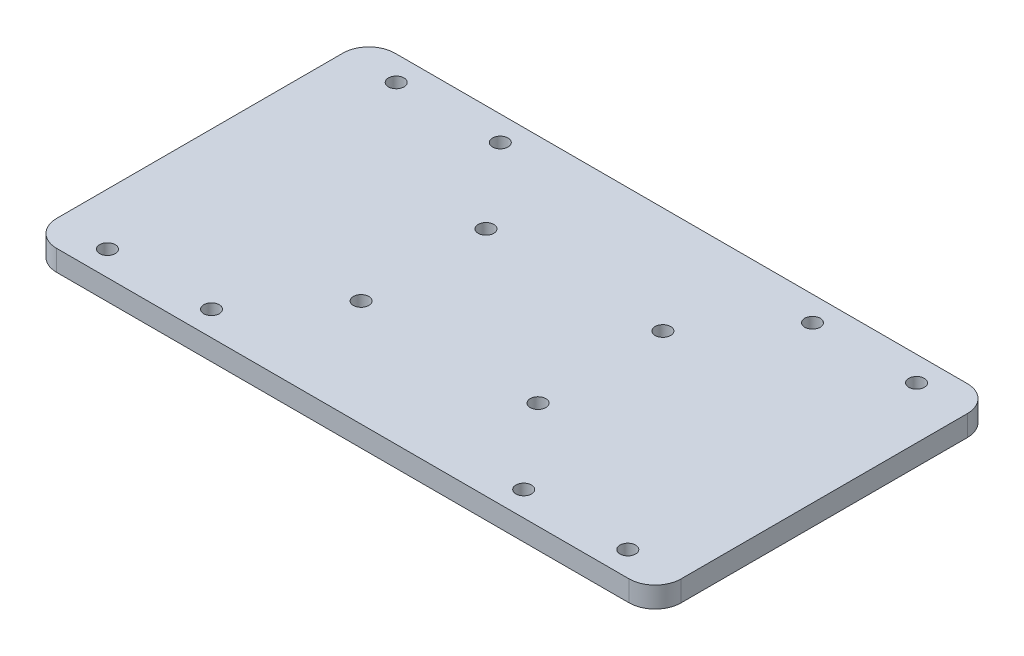
ISO-10303-21;
HEADER;
FILE_DESCRIPTION(('STEP AP214'),'2;1');
FILE_NAME('part.step','',(''),(''),'','','');
FILE_SCHEMA(('AUTOMOTIVE_DESIGN { 1 0 10303 214 1 1 1 1 }'));
ENDSEC;
DATA;
#1=APPLICATION_CONTEXT('core data for automotive mechanical design processes');
#2=APPLICATION_PROTOCOL_DEFINITION('international standard','automotive_design',2000,#1);
#3=PRODUCT_CONTEXT('',#1,'mechanical');
#4=PRODUCT('Part','Part','',(#3));
#5=PRODUCT_RELATED_PRODUCT_CATEGORY('part','',(#4));
#6=PRODUCT_DEFINITION_FORMATION('','',#4);
#7=PRODUCT_DEFINITION_CONTEXT('part definition',#1,'design');
#8=PRODUCT_DEFINITION('design','',#6,#7);
#9=PRODUCT_DEFINITION_SHAPE('','',#8);
#10=(LENGTH_UNIT() NAMED_UNIT(*) SI_UNIT(.MILLI.,.METRE.));
#11=(NAMED_UNIT(*) PLANE_ANGLE_UNIT() SI_UNIT($,.RADIAN.));
#12=(NAMED_UNIT(*) SI_UNIT($,.STERADIAN.) SOLID_ANGLE_UNIT());
#13=UNCERTAINTY_MEASURE_WITH_UNIT(LENGTH_MEASURE(1.E-05),#10,'distance_accuracy_value','');
#14=(GEOMETRIC_REPRESENTATION_CONTEXT(3) GLOBAL_UNCERTAINTY_ASSIGNED_CONTEXT((#13)) GLOBAL_UNIT_ASSIGNED_CONTEXT((#10,
#11,#12)) REPRESENTATION_CONTEXT('',''));
#15=CARTESIAN_POINT('',(0.,0.,0.));
#16=DIRECTION('',(0.,0.,1.));
#17=DIRECTION('',(1.,0.,0.));
#18=AXIS2_PLACEMENT_3D('',#15,#16,#17);
#19=CARTESIAN_POINT('',(60.,4.,32.5));
#20=DIRECTION('',(-1.,0.,0.));
#21=DIRECTION('',(0.,0.,1.));
#22=AXIS2_PLACEMENT_3D('',#19,#20,#21);
#23=PLANE('',#22);
#24=DIRECTION('',(0.,0.,-1.));
#25=VECTOR('',#24,1.);
#26=CARTESIAN_POINT('',(60.,4.,32.5));
#27=LINE('',#26,#25);
#28=CARTESIAN_POINT('',(60.,4.,27.5));
#29=VERTEX_POINT('',#28);
#30=CARTESIAN_POINT('',(60.,4.,-27.5));
#31=VERTEX_POINT('',#30);
#32=EDGE_CURVE('E133',#29,#31,#27,.T.);
#33=ORIENTED_EDGE('',*,*,#32,.F.);
#34=DIRECTION('',(0.,-1.,0.));
#35=VECTOR('',#34,1.);
#36=CARTESIAN_POINT('',(60.,4.,27.5));
#37=LINE('',#36,#35);
#38=CARTESIAN_POINT('',(60.,0.,27.5));
#39=VERTEX_POINT('',#38);
#40=EDGE_CURVE('E159',#29,#39,#37,.T.);
#41=ORIENTED_EDGE('',*,*,#40,.T.);
#42=DIRECTION('',(0.,0.,-1.));
#43=VECTOR('',#42,1.);
#44=CARTESIAN_POINT('',(60.,0.,32.5));
#45=LINE('',#44,#43);
#46=CARTESIAN_POINT('',(60.,0.,-27.5));
#47=VERTEX_POINT('',#46);
#48=EDGE_CURVE('E165',#39,#47,#45,.T.);
#49=ORIENTED_EDGE('',*,*,#48,.T.);
#50=DIRECTION('',(0.,-1.,0.));
#51=VECTOR('',#50,1.);
#52=CARTESIAN_POINT('',(60.,4.,-27.5));
#53=LINE('',#52,#51);
#54=EDGE_CURVE('E157',#47,#31,#53,.F.);
#55=ORIENTED_EDGE('',*,*,#54,.T.);
#56=EDGE_LOOP('',(#33,#41,#49,#55));
#57=FACE_BOUND('',#56,.T.);
#58=ADVANCED_FACE('F41',(#57),#23,.F.);
#59=CARTESIAN_POINT('',(-60.,4.,-32.5));
#60=DIRECTION('',(0.,0.,1.));
#61=DIRECTION('',(1.,0.,0.));
#62=AXIS2_PLACEMENT_3D('',#59,#60,#61);
#63=PLANE('',#62);
#64=DIRECTION('',(-1.,0.,0.));
#65=VECTOR('',#64,1.);
#66=CARTESIAN_POINT('',(-60.,4.,-32.5));
#67=LINE('',#66,#65);
#68=CARTESIAN_POINT('',(55.,4.,-32.5));
#69=VERTEX_POINT('',#68);
#70=CARTESIAN_POINT('',(-55.,4.,-32.5));
#71=VERTEX_POINT('',#70);
#72=EDGE_CURVE('E136',#69,#71,#67,.T.);
#73=ORIENTED_EDGE('',*,*,#72,.F.);
#74=DIRECTION('',(0.,-1.,0.));
#75=VECTOR('',#74,1.);
#76=CARTESIAN_POINT('',(55.,4.,-32.5));
#77=LINE('',#76,#75);
#78=CARTESIAN_POINT('',(55.,0.,-32.5));
#79=VERTEX_POINT('',#78);
#80=EDGE_CURVE('E11',#69,#79,#77,.T.);
#81=ORIENTED_EDGE('',*,*,#80,.T.);
#82=DIRECTION('',(-1.,0.,0.));
#83=VECTOR('',#82,1.);
#84=CARTESIAN_POINT('',(-60.,0.,-32.5));
#85=LINE('',#84,#83);
#86=CARTESIAN_POINT('',(-55.,0.,-32.5));
#87=VERTEX_POINT('',#86);
#88=EDGE_CURVE('E138',#79,#87,#85,.T.);
#89=ORIENTED_EDGE('',*,*,#88,.T.);
#90=DIRECTION('',(0.,-1.,0.));
#91=VECTOR('',#90,1.);
#92=CARTESIAN_POINT('',(-55.,4.,-32.5));
#93=LINE('',#92,#91);
#94=EDGE_CURVE('E49',#87,#71,#93,.F.);
#95=ORIENTED_EDGE('',*,*,#94,.T.);
#96=EDGE_LOOP('',(#73,#81,#89,#95));
#97=FACE_BOUND('',#96,.T.);
#98=ADVANCED_FACE('F291',(#97),#63,.F.);
#99=CARTESIAN_POINT('',(-60.,4.,32.5));
#100=DIRECTION('',(1.,0.,0.));
#101=DIRECTION('',(0.,0.,-1.));
#102=AXIS2_PLACEMENT_3D('',#99,#100,#101);
#103=PLANE('',#102);
#104=DIRECTION('',(0.,0.,1.));
#105=VECTOR('',#104,1.);
#106=CARTESIAN_POINT('',(-60.,0.,32.5));
#107=LINE('',#106,#105);
#108=CARTESIAN_POINT('',(-60.,0.,-27.5));
#109=VERTEX_POINT('',#108);
#110=CARTESIAN_POINT('',(-60.,0.,27.5));
#111=VERTEX_POINT('',#110);
#112=EDGE_CURVE('E134',#109,#111,#107,.T.);
#113=ORIENTED_EDGE('',*,*,#112,.T.);
#114=DIRECTION('',(0.,-1.,0.));
#115=VECTOR('',#114,1.);
#116=CARTESIAN_POINT('',(-60.,4.,27.5));
#117=LINE('',#116,#115);
#118=CARTESIAN_POINT('',(-60.,4.,27.5));
#119=VERTEX_POINT('',#118);
#120=EDGE_CURVE('E112',#111,#119,#117,.F.);
#121=ORIENTED_EDGE('',*,*,#120,.T.);
#122=DIRECTION('',(0.,0.,1.));
#123=VECTOR('',#122,1.);
#124=CARTESIAN_POINT('',(-60.,4.,32.5));
#125=LINE('',#124,#123);
#126=CARTESIAN_POINT('',(-60.,4.,-27.5));
#127=VERTEX_POINT('',#126);
#128=EDGE_CURVE('E177',#127,#119,#125,.T.);
#129=ORIENTED_EDGE('',*,*,#128,.F.);
#130=DIRECTION('',(0.,-1.,0.));
#131=VECTOR('',#130,1.);
#132=CARTESIAN_POINT('',(-60.,4.,-27.5));
#133=LINE('',#132,#131);
#134=EDGE_CURVE('E117',#127,#109,#133,.T.);
#135=ORIENTED_EDGE('',*,*,#134,.T.);
#136=EDGE_LOOP('',(#113,#121,#129,#135));
#137=FACE_BOUND('',#136,.T.);
#138=ADVANCED_FACE('F289',(#137),#103,.F.);
#139=CARTESIAN_POINT('',(-60.,4.,32.5));
#140=DIRECTION('',(0.,0.,-1.));
#141=DIRECTION('',(-1.,0.,0.));
#142=AXIS2_PLACEMENT_3D('',#139,#140,#141);
#143=PLANE('',#142);
#144=DIRECTION('',(1.,0.,0.));
#145=VECTOR('',#144,1.);
#146=CARTESIAN_POINT('',(-60.,4.,32.5));
#147=LINE('',#146,#145);
#148=CARTESIAN_POINT('',(-55.,4.,32.5));
#149=VERTEX_POINT('',#148);
#150=CARTESIAN_POINT('',(55.,4.,32.5));
#151=VERTEX_POINT('',#150);
#152=EDGE_CURVE('E127',#149,#151,#147,.T.);
#153=ORIENTED_EDGE('',*,*,#152,.F.);
#154=DIRECTION('',(0.,-1.,0.));
#155=VECTOR('',#154,1.);
#156=CARTESIAN_POINT('',(-55.,4.,32.5));
#157=LINE('',#156,#155);
#158=CARTESIAN_POINT('',(-55.,0.,32.5));
#159=VERTEX_POINT('',#158);
#160=EDGE_CURVE('E111',#149,#159,#157,.T.);
#161=ORIENTED_EDGE('',*,*,#160,.T.);
#162=DIRECTION('',(1.,0.,0.));
#163=VECTOR('',#162,1.);
#164=CARTESIAN_POINT('',(-60.,0.,32.5));
#165=LINE('',#164,#163);
#166=CARTESIAN_POINT('',(55.,0.,32.5));
#167=VERTEX_POINT('',#166);
#168=EDGE_CURVE('E124',#159,#167,#165,.T.);
#169=ORIENTED_EDGE('',*,*,#168,.T.);
#170=DIRECTION('',(0.,-1.,0.));
#171=VECTOR('',#170,1.);
#172=CARTESIAN_POINT('',(55.,4.,32.5));
#173=LINE('',#172,#171);
#174=EDGE_CURVE('E129',#167,#151,#173,.F.);
#175=ORIENTED_EDGE('',*,*,#174,.T.);
#176=EDGE_LOOP('',(#153,#161,#169,#175));
#177=FACE_BOUND('',#176,.T.);
#178=ADVANCED_FACE('F123',(#177),#143,.F.);
#179=CARTESIAN_POINT('',(0.,4.,0.));
#180=DIRECTION('',(0.,-1.,0.));
#181=DIRECTION('',(0.,0.,-1.));
#182=AXIS2_PLACEMENT_3D('',#179,#180,#181);
#183=PLANE('',#182);
#184=CARTESIAN_POINT('',(-17.,4.,-12.));
#185=DIRECTION('',(0.,-1.,0.));
#186=DIRECTION('',(0.,0.,-1.));
#187=AXIS2_PLACEMENT_3D('',#184,#185,#186);
#188=CIRCLE('',#187,1.5);
#189=CARTESIAN_POINT('',(-17.,4.,-13.5));
#190=VERTEX_POINT('',#189);
#191=EDGE_CURVE('E232',#190,#190,#188,.T.);
#192=ORIENTED_EDGE('',*,*,#191,.T.);
#193=EDGE_LOOP('',(#192));
#194=FACE_BOUND('',#193,.T.);
#195=CARTESIAN_POINT('',(17.,4.,-12.));
#196=DIRECTION('',(0.,-1.,0.));
#197=DIRECTION('',(0.,0.,-1.));
#198=AXIS2_PLACEMENT_3D('',#195,#196,#197);
#199=CIRCLE('',#198,1.5);
#200=CARTESIAN_POINT('',(17.,4.,-13.5));
#201=VERTEX_POINT('',#200);
#202=EDGE_CURVE('E238',#201,#201,#199,.T.);
#203=ORIENTED_EDGE('',*,*,#202,.T.);
#204=EDGE_LOOP('',(#203));
#205=FACE_BOUND('',#204,.T.);
#206=CARTESIAN_POINT('',(17.,4.,12.));
#207=DIRECTION('',(0.,-1.,0.));
#208=DIRECTION('',(0.,0.,-1.));
#209=AXIS2_PLACEMENT_3D('',#206,#207,#208);
#210=CIRCLE('',#209,1.5);
#211=CARTESIAN_POINT('',(17.,4.,10.5));
#212=VERTEX_POINT('',#211);
#213=EDGE_CURVE('E244',#212,#212,#210,.T.);
#214=ORIENTED_EDGE('',*,*,#213,.T.);
#215=EDGE_LOOP('',(#214));
#216=FACE_BOUND('',#215,.T.);
#217=CARTESIAN_POINT('',(-17.,4.,12.));
#218=DIRECTION('',(0.,-1.,0.));
#219=DIRECTION('',(0.,0.,-1.));
#220=AXIS2_PLACEMENT_3D('',#217,#218,#219);
#221=CIRCLE('',#220,1.5);
#222=CARTESIAN_POINT('',(-17.,4.,10.5));
#223=VERTEX_POINT('',#222);
#224=EDGE_CURVE('E212',#223,#223,#221,.T.);
#225=ORIENTED_EDGE('',*,*,#224,.T.);
#226=EDGE_LOOP('',(#225));
#227=FACE_BOUND('',#226,.T.);
#228=CARTESIAN_POINT('',(-30.,4.,27.75));
#229=DIRECTION('',(0.,-1.,0.));
#230=DIRECTION('',(0.,0.,1.));
#231=AXIS2_PLACEMENT_3D('',#228,#229,#230);
#232=CIRCLE('',#231,1.50000000000001);
#233=CARTESIAN_POINT('',(-30.,4.,29.25));
#234=VERTEX_POINT('',#233);
#235=EDGE_CURVE('E208',#234,#234,#232,.T.);
#236=ORIENTED_EDGE('',*,*,#235,.T.);
#237=EDGE_LOOP('',(#236));
#238=FACE_BOUND('',#237,.T.);
#239=CARTESIAN_POINT('',(-30.,4.,-27.75));
#240=DIRECTION('',(0.,-1.,0.));
#241=DIRECTION('',(0.,0.,1.));
#242=AXIS2_PLACEMENT_3D('',#239,#240,#241);
#243=CIRCLE('',#242,1.5);
#244=CARTESIAN_POINT('',(-30.,4.,-26.25));
#245=VERTEX_POINT('',#244);
#246=EDGE_CURVE('E215',#245,#245,#243,.T.);
#247=ORIENTED_EDGE('',*,*,#246,.T.);
#248=EDGE_LOOP('',(#247));
#249=FACE_BOUND('',#248,.T.);
#250=CARTESIAN_POINT('',(-50.,4.,-27.75));
#251=DIRECTION('',(0.,-1.,0.));
#252=DIRECTION('',(0.,0.,1.));
#253=AXIS2_PLACEMENT_3D('',#250,#251,#252);
#254=CIRCLE('',#253,1.5);
#255=CARTESIAN_POINT('',(-50.,4.,-26.25));
#256=VERTEX_POINT('',#255);
#257=EDGE_CURVE('E221',#256,#256,#254,.T.);
#258=ORIENTED_EDGE('',*,*,#257,.T.);
#259=EDGE_LOOP('',(#258));
#260=FACE_BOUND('',#259,.T.);
#261=CARTESIAN_POINT('',(-50.,4.,27.75));
#262=DIRECTION('',(0.,-1.,0.));
#263=DIRECTION('',(0.,0.,1.));
#264=AXIS2_PLACEMENT_3D('',#261,#262,#263);
#265=CIRCLE('',#264,1.5);
#266=CARTESIAN_POINT('',(-50.,4.,29.25));
#267=VERTEX_POINT('',#266);
#268=EDGE_CURVE('E202',#267,#267,#265,.T.);
#269=ORIENTED_EDGE('',*,*,#268,.T.);
#270=EDGE_LOOP('',(#269));
#271=FACE_BOUND('',#270,.T.);
#272=CARTESIAN_POINT('',(30.,4.,27.75));
#273=DIRECTION('',(0.,1.,0.));
#274=DIRECTION('',(0.,0.,1.));
#275=AXIS2_PLACEMENT_3D('',#272,#273,#274);
#276=CIRCLE('',#275,1.50000000000001);
#277=CARTESIAN_POINT('',(30.,4.,29.25));
#278=VERTEX_POINT('',#277);
#279=EDGE_CURVE('E187',#278,#278,#276,.T.);
#280=ORIENTED_EDGE('',*,*,#279,.F.);
#281=EDGE_LOOP('',(#280));
#282=FACE_BOUND('',#281,.T.);
#283=CARTESIAN_POINT('',(30.,4.,-27.75));
#284=DIRECTION('',(0.,1.,0.));
#285=DIRECTION('',(0.,0.,1.));
#286=AXIS2_PLACEMENT_3D('',#283,#284,#285);
#287=CIRCLE('',#286,1.5);
#288=CARTESIAN_POINT('',(30.,4.,-26.25));
#289=VERTEX_POINT('',#288);
#290=EDGE_CURVE('E194',#289,#289,#287,.T.);
#291=ORIENTED_EDGE('',*,*,#290,.F.);
#292=EDGE_LOOP('',(#291));
#293=FACE_BOUND('',#292,.T.);
#294=CARTESIAN_POINT('',(50.,4.,-27.75));
#295=DIRECTION('',(0.,1.,0.));
#296=DIRECTION('',(0.,0.,1.));
#297=AXIS2_PLACEMENT_3D('',#294,#295,#296);
#298=CIRCLE('',#297,1.5);
#299=CARTESIAN_POINT('',(50.,4.,-26.25));
#300=VERTEX_POINT('',#299);
#301=EDGE_CURVE('E182',#300,#300,#298,.T.);
#302=ORIENTED_EDGE('',*,*,#301,.F.);
#303=EDGE_LOOP('',(#302));
#304=FACE_BOUND('',#303,.T.);
#305=CARTESIAN_POINT('',(50.,4.,27.75));
#306=DIRECTION('',(0.,1.,0.));
#307=DIRECTION('',(0.,0.,1.));
#308=AXIS2_PLACEMENT_3D('',#305,#306,#307);
#309=CIRCLE('',#308,1.5);
#310=CARTESIAN_POINT('',(50.,4.,29.25));
#311=VERTEX_POINT('',#310);
#312=EDGE_CURVE('E173',#311,#311,#309,.T.);
#313=ORIENTED_EDGE('',*,*,#312,.F.);
#314=EDGE_LOOP('',(#313));
#315=FACE_BOUND('',#314,.T.);
#316=ORIENTED_EDGE('',*,*,#128,.T.);
#317=CARTESIAN_POINT('',(-55.,4.,27.5));
#318=DIRECTION('',(0.,-1.,0.));
#319=DIRECTION('',(0.,0.,-1.));
#320=AXIS2_PLACEMENT_3D('',#317,#318,#319);
#321=CIRCLE('',#320,5.);
#322=EDGE_CURVE('E155',#119,#149,#321,.F.);
#323=ORIENTED_EDGE('',*,*,#322,.T.);
#324=ORIENTED_EDGE('',*,*,#152,.T.);
#325=CARTESIAN_POINT('',(55.,4.,27.5));
#326=DIRECTION('',(0.,-1.,0.));
#327=DIRECTION('',(0.,0.,-1.));
#328=AXIS2_PLACEMENT_3D('',#325,#326,#327);
#329=CIRCLE('',#328,5.);
#330=EDGE_CURVE('E153',#151,#29,#329,.F.);
#331=ORIENTED_EDGE('',*,*,#330,.T.);
#332=ORIENTED_EDGE('',*,*,#32,.T.);
#333=CARTESIAN_POINT('',(55.,4.,-27.5));
#334=DIRECTION('',(0.,-1.,0.));
#335=DIRECTION('',(0.,0.,-1.));
#336=AXIS2_PLACEMENT_3D('',#333,#334,#335);
#337=CIRCLE('',#336,5.);
#338=EDGE_CURVE('E62',#31,#69,#337,.F.);
#339=ORIENTED_EDGE('',*,*,#338,.T.);
#340=ORIENTED_EDGE('',*,*,#72,.T.);
#341=CARTESIAN_POINT('',(-55.,4.,-27.5));
#342=DIRECTION('',(0.,-1.,0.));
#343=DIRECTION('',(0.,0.,-1.));
#344=AXIS2_PLACEMENT_3D('',#341,#342,#343);
#345=CIRCLE('',#344,5.);
#346=EDGE_CURVE('E150',#71,#127,#345,.F.);
#347=ORIENTED_EDGE('',*,*,#346,.T.);
#348=EDGE_LOOP('',(#316,#323,#324,#331,#332,#339,#340,#347));
#349=FACE_BOUND('',#348,.T.);
#350=ADVANCED_FACE('F255',(#194,#205,#216,#227,#238,#249,#260,#271,#282,#293,#304,#315,#349),
#183,.F.);
#351=CARTESIAN_POINT('',(0.,0.,0.));
#352=DIRECTION('',(0.,-1.,0.));
#353=DIRECTION('',(0.,0.,-1.));
#354=AXIS2_PLACEMENT_3D('',#351,#352,#353);
#355=PLANE('',#354);
#356=CARTESIAN_POINT('',(-17.,0.,-12.));
#357=DIRECTION('',(0.,-1.,0.));
#358=DIRECTION('',(0.,0.,-1.));
#359=AXIS2_PLACEMENT_3D('',#356,#357,#358);
#360=CIRCLE('',#359,1.5);
#361=CARTESIAN_POINT('',(-17.,0.,-13.5));
#362=VERTEX_POINT('',#361);
#363=EDGE_CURVE('E235',#362,#362,#360,.T.);
#364=ORIENTED_EDGE('',*,*,#363,.F.);
#365=EDGE_LOOP('',(#364));
#366=FACE_BOUND('',#365,.T.);
#367=CARTESIAN_POINT('',(17.,0.,-12.));
#368=DIRECTION('',(0.,-1.,0.));
#369=DIRECTION('',(0.,0.,-1.));
#370=AXIS2_PLACEMENT_3D('',#367,#368,#369);
#371=CIRCLE('',#370,1.5);
#372=CARTESIAN_POINT('',(17.,0.,-13.5));
#373=VERTEX_POINT('',#372);
#374=EDGE_CURVE('E241',#373,#373,#371,.T.);
#375=ORIENTED_EDGE('',*,*,#374,.F.);
#376=EDGE_LOOP('',(#375));
#377=FACE_BOUND('',#376,.T.);
#378=CARTESIAN_POINT('',(17.,0.,12.));
#379=DIRECTION('',(0.,-1.,0.));
#380=DIRECTION('',(0.,0.,-1.));
#381=AXIS2_PLACEMENT_3D('',#378,#379,#380);
#382=CIRCLE('',#381,1.5);
#383=CARTESIAN_POINT('',(17.,0.,10.5));
#384=VERTEX_POINT('',#383);
#385=EDGE_CURVE('E229',#384,#384,#382,.T.);
#386=ORIENTED_EDGE('',*,*,#385,.F.);
#387=EDGE_LOOP('',(#386));
#388=FACE_BOUND('',#387,.T.);
#389=CARTESIAN_POINT('',(-17.,0.,12.));
#390=DIRECTION('',(0.,-1.,0.));
#391=DIRECTION('',(0.,0.,-1.));
#392=AXIS2_PLACEMENT_3D('',#389,#390,#391);
#393=CIRCLE('',#392,1.5);
#394=CARTESIAN_POINT('',(-17.,0.,10.5));
#395=VERTEX_POINT('',#394);
#396=EDGE_CURVE('E226',#395,#395,#393,.T.);
#397=ORIENTED_EDGE('',*,*,#396,.F.);
#398=EDGE_LOOP('',(#397));
#399=FACE_BOUND('',#398,.T.);
#400=CARTESIAN_POINT('',(-30.,0.,27.75));
#401=DIRECTION('',(0.,-1.,0.));
#402=DIRECTION('',(0.,0.,1.));
#403=AXIS2_PLACEMENT_3D('',#400,#401,#402);
#404=CIRCLE('',#403,1.50000000000001);
#405=CARTESIAN_POINT('',(-30.,0.,29.25));
#406=VERTEX_POINT('',#405);
#407=EDGE_CURVE('E211',#406,#406,#404,.T.);
#408=ORIENTED_EDGE('',*,*,#407,.F.);
#409=EDGE_LOOP('',(#408));
#410=FACE_BOUND('',#409,.T.);
#411=CARTESIAN_POINT('',(-30.,0.,-27.75));
#412=DIRECTION('',(0.,-1.,0.));
#413=DIRECTION('',(0.,0.,1.));
#414=AXIS2_PLACEMENT_3D('',#411,#412,#413);
#415=CIRCLE('',#414,1.5);
#416=CARTESIAN_POINT('',(-30.,0.,-26.25));
#417=VERTEX_POINT('',#416);
#418=EDGE_CURVE('E218',#417,#417,#415,.T.);
#419=ORIENTED_EDGE('',*,*,#418,.F.);
#420=EDGE_LOOP('',(#419));
#421=FACE_BOUND('',#420,.T.);
#422=CARTESIAN_POINT('',(-50.,0.,-27.75));
#423=DIRECTION('',(0.,-1.,0.));
#424=DIRECTION('',(0.,0.,1.));
#425=AXIS2_PLACEMENT_3D('',#422,#423,#424);
#426=CIRCLE('',#425,1.5);
#427=CARTESIAN_POINT('',(-50.,0.,-26.25));
#428=VERTEX_POINT('',#427);
#429=EDGE_CURVE('E205',#428,#428,#426,.T.);
#430=ORIENTED_EDGE('',*,*,#429,.F.);
#431=EDGE_LOOP('',(#430));
#432=FACE_BOUND('',#431,.T.);
#433=CARTESIAN_POINT('',(-50.,0.,27.75));
#434=DIRECTION('',(0.,-1.,0.));
#435=DIRECTION('',(0.,0.,1.));
#436=AXIS2_PLACEMENT_3D('',#433,#434,#435);
#437=CIRCLE('',#436,1.5);
#438=CARTESIAN_POINT('',(-50.,0.,29.25));
#439=VERTEX_POINT('',#438);
#440=EDGE_CURVE('E188',#439,#439,#437,.T.);
#441=ORIENTED_EDGE('',*,*,#440,.F.);
#442=EDGE_LOOP('',(#441));
#443=FACE_BOUND('',#442,.T.);
#444=CARTESIAN_POINT('',(30.,0.,27.75));
#445=DIRECTION('',(0.,1.,0.));
#446=DIRECTION('',(0.,0.,1.));
#447=AXIS2_PLACEMENT_3D('',#444,#445,#446);
#448=CIRCLE('',#447,1.50000000000001);
#449=CARTESIAN_POINT('',(30.,0.,29.25));
#450=VERTEX_POINT('',#449);
#451=EDGE_CURVE('E184',#450,#450,#448,.T.);
#452=ORIENTED_EDGE('',*,*,#451,.T.);
#453=EDGE_LOOP('',(#452));
#454=FACE_BOUND('',#453,.T.);
#455=CARTESIAN_POINT('',(30.,0.,-27.75));
#456=DIRECTION('',(0.,1.,0.));
#457=DIRECTION('',(0.,0.,1.));
#458=AXIS2_PLACEMENT_3D('',#455,#456,#457);
#459=CIRCLE('',#458,1.5);
#460=CARTESIAN_POINT('',(30.,0.,-26.25));
#461=VERTEX_POINT('',#460);
#462=EDGE_CURVE('E191',#461,#461,#459,.T.);
#463=ORIENTED_EDGE('',*,*,#462,.T.);
#464=EDGE_LOOP('',(#463));
#465=FACE_BOUND('',#464,.T.);
#466=CARTESIAN_POINT('',(50.,0.,-27.75));
#467=DIRECTION('',(0.,1.,0.));
#468=DIRECTION('',(0.,0.,1.));
#469=AXIS2_PLACEMENT_3D('',#466,#467,#468);
#470=CIRCLE('',#469,1.5);
#471=CARTESIAN_POINT('',(50.,0.,-26.25));
#472=VERTEX_POINT('',#471);
#473=EDGE_CURVE('E197',#472,#472,#470,.T.);
#474=ORIENTED_EDGE('',*,*,#473,.T.);
#475=EDGE_LOOP('',(#474));
#476=FACE_BOUND('',#475,.T.);
#477=CARTESIAN_POINT('',(50.,0.,27.75));
#478=DIRECTION('',(0.,1.,0.));
#479=DIRECTION('',(0.,0.,1.));
#480=AXIS2_PLACEMENT_3D('',#477,#478,#479);
#481=CIRCLE('',#480,1.5);
#482=CARTESIAN_POINT('',(50.,0.,29.25));
#483=VERTEX_POINT('',#482);
#484=EDGE_CURVE('E170',#483,#483,#481,.T.);
#485=ORIENTED_EDGE('',*,*,#484,.T.);
#486=EDGE_LOOP('',(#485));
#487=FACE_BOUND('',#486,.T.);
#488=ORIENTED_EDGE('',*,*,#168,.F.);
#489=CARTESIAN_POINT('',(-55.,0.,27.5));
#490=DIRECTION('',(0.,-1.,0.));
#491=DIRECTION('',(0.,0.,-1.));
#492=AXIS2_PLACEMENT_3D('',#489,#490,#491);
#493=CIRCLE('',#492,5.);
#494=EDGE_CURVE('E107',#159,#111,#493,.T.);
#495=ORIENTED_EDGE('',*,*,#494,.T.);
#496=ORIENTED_EDGE('',*,*,#112,.F.);
#497=CARTESIAN_POINT('',(-55.,0.,-27.5));
#498=DIRECTION('',(0.,-1.,0.));
#499=DIRECTION('',(0.,0.,-1.));
#500=AXIS2_PLACEMENT_3D('',#497,#498,#499);
#501=CIRCLE('',#500,5.);
#502=EDGE_CURVE('E128',#109,#87,#501,.T.);
#503=ORIENTED_EDGE('',*,*,#502,.T.);
#504=ORIENTED_EDGE('',*,*,#88,.F.);
#505=CARTESIAN_POINT('',(55.,0.,-27.5));
#506=DIRECTION('',(0.,-1.,0.));
#507=DIRECTION('',(0.,0.,-1.));
#508=AXIS2_PLACEMENT_3D('',#505,#506,#507);
#509=CIRCLE('',#508,5.);
#510=EDGE_CURVE('E144',#79,#47,#509,.T.);
#511=ORIENTED_EDGE('',*,*,#510,.T.);
#512=ORIENTED_EDGE('',*,*,#48,.F.);
#513=CARTESIAN_POINT('',(55.,0.,27.5));
#514=DIRECTION('',(0.,-1.,0.));
#515=DIRECTION('',(0.,0.,-1.));
#516=AXIS2_PLACEMENT_3D('',#513,#514,#515);
#517=CIRCLE('',#516,5.);
#518=EDGE_CURVE('E118',#39,#167,#517,.T.);
#519=ORIENTED_EDGE('',*,*,#518,.T.);
#520=EDGE_LOOP('',(#488,#495,#496,#503,#504,#511,#512,#519));
#521=FACE_BOUND('',#520,.T.);
#522=ADVANCED_FACE('F131',(#366,#377,#388,#399,#410,#421,#432,#443,#454,#465,#476,#487,#521),
#355,.T.);
#523=CARTESIAN_POINT('',(50.,0.,27.75));
#524=DIRECTION('',(0.,1.,0.));
#525=DIRECTION('',(0.,0.,1.));
#526=AXIS2_PLACEMENT_3D('',#523,#524,#525);
#527=CYLINDRICAL_SURFACE('',#526,1.5);
#528=ORIENTED_EDGE('',*,*,#484,.F.);
#529=EDGE_LOOP('',(#528));
#530=FACE_BOUND('',#529,.T.);
#531=ORIENTED_EDGE('',*,*,#312,.T.);
#532=EDGE_LOOP('',(#531));
#533=FACE_BOUND('',#532,.T.);
#534=ADVANCED_FACE('F254',(#530,#533),#527,.F.);
#535=CARTESIAN_POINT('',(50.,0.,-27.75));
#536=DIRECTION('',(0.,1.,0.));
#537=DIRECTION('',(0.,0.,1.));
#538=AXIS2_PLACEMENT_3D('',#535,#536,#537);
#539=CYLINDRICAL_SURFACE('',#538,1.5);
#540=ORIENTED_EDGE('',*,*,#473,.F.);
#541=EDGE_LOOP('',(#540));
#542=FACE_BOUND('',#541,.T.);
#543=ORIENTED_EDGE('',*,*,#301,.T.);
#544=EDGE_LOOP('',(#543));
#545=FACE_BOUND('',#544,.T.);
#546=ADVANCED_FACE('F278',(#542,#545),#539,.F.);
#547=CARTESIAN_POINT('',(30.,0.,-27.75));
#548=DIRECTION('',(0.,1.,0.));
#549=DIRECTION('',(0.,0.,1.));
#550=AXIS2_PLACEMENT_3D('',#547,#548,#549);
#551=CYLINDRICAL_SURFACE('',#550,1.5);
#552=ORIENTED_EDGE('',*,*,#462,.F.);
#553=EDGE_LOOP('',(#552));
#554=FACE_BOUND('',#553,.T.);
#555=ORIENTED_EDGE('',*,*,#290,.T.);
#556=EDGE_LOOP('',(#555));
#557=FACE_BOUND('',#556,.T.);
#558=ADVANCED_FACE('F320',(#554,#557),#551,.F.);
#559=CARTESIAN_POINT('',(30.,0.,27.75));
#560=DIRECTION('',(0.,1.,0.));
#561=DIRECTION('',(0.,0.,1.));
#562=AXIS2_PLACEMENT_3D('',#559,#560,#561);
#563=CYLINDRICAL_SURFACE('',#562,1.50000000000001);
#564=ORIENTED_EDGE('',*,*,#451,.F.);
#565=EDGE_LOOP('',(#564));
#566=FACE_BOUND('',#565,.T.);
#567=ORIENTED_EDGE('',*,*,#279,.T.);
#568=EDGE_LOOP('',(#567));
#569=FACE_BOUND('',#568,.T.);
#570=ADVANCED_FACE('F316',(#566,#569),#563,.F.);
#571=CARTESIAN_POINT('',(-50.,0.,27.75));
#572=DIRECTION('',(0.,1.,0.));
#573=DIRECTION('',(0.,0.,1.));
#574=AXIS2_PLACEMENT_3D('',#571,#572,#573);
#575=CYLINDRICAL_SURFACE('',#574,1.5);
#576=ORIENTED_EDGE('',*,*,#440,.T.);
#577=EDGE_LOOP('',(#576));
#578=FACE_BOUND('',#577,.T.);
#579=ORIENTED_EDGE('',*,*,#268,.F.);
#580=EDGE_LOOP('',(#579));
#581=FACE_BOUND('',#580,.T.);
#582=ADVANCED_FACE('F319',(#578,#581),#575,.F.);
#583=CARTESIAN_POINT('',(-50.,0.,-27.75));
#584=DIRECTION('',(0.,1.,0.));
#585=DIRECTION('',(0.,0.,1.));
#586=AXIS2_PLACEMENT_3D('',#583,#584,#585);
#587=CYLINDRICAL_SURFACE('',#586,1.5);
#588=ORIENTED_EDGE('',*,*,#429,.T.);
#589=EDGE_LOOP('',(#588));
#590=FACE_BOUND('',#589,.T.);
#591=ORIENTED_EDGE('',*,*,#257,.F.);
#592=EDGE_LOOP('',(#591));
#593=FACE_BOUND('',#592,.T.);
#594=ADVANCED_FACE('F330',(#590,#593),#587,.F.);
#595=CARTESIAN_POINT('',(-30.,0.,-27.75));
#596=DIRECTION('',(0.,1.,0.));
#597=DIRECTION('',(0.,0.,1.));
#598=AXIS2_PLACEMENT_3D('',#595,#596,#597);
#599=CYLINDRICAL_SURFACE('',#598,1.5);
#600=ORIENTED_EDGE('',*,*,#418,.T.);
#601=EDGE_LOOP('',(#600));
#602=FACE_BOUND('',#601,.T.);
#603=ORIENTED_EDGE('',*,*,#246,.F.);
#604=EDGE_LOOP('',(#603));
#605=FACE_BOUND('',#604,.T.);
#606=ADVANCED_FACE('F333',(#602,#605),#599,.F.);
#607=CARTESIAN_POINT('',(-30.,0.,27.75));
#608=DIRECTION('',(0.,1.,0.));
#609=DIRECTION('',(0.,0.,1.));
#610=AXIS2_PLACEMENT_3D('',#607,#608,#609);
#611=CYLINDRICAL_SURFACE('',#610,1.50000000000001);
#612=ORIENTED_EDGE('',*,*,#407,.T.);
#613=EDGE_LOOP('',(#612));
#614=FACE_BOUND('',#613,.T.);
#615=ORIENTED_EDGE('',*,*,#235,.F.);
#616=EDGE_LOOP('',(#615));
#617=FACE_BOUND('',#616,.T.);
#618=ADVANCED_FACE('F302',(#614,#617),#611,.F.);
#619=CARTESIAN_POINT('',(-55.,4.,27.5));
#620=DIRECTION('',(0.,-1.,0.));
#621=DIRECTION('',(0.,0.,-1.));
#622=AXIS2_PLACEMENT_3D('',#619,#620,#621);
#623=CYLINDRICAL_SURFACE('',#622,5.);
#624=ORIENTED_EDGE('',*,*,#322,.F.);
#625=ORIENTED_EDGE('',*,*,#120,.F.);
#626=ORIENTED_EDGE('',*,*,#494,.F.);
#627=ORIENTED_EDGE('',*,*,#160,.F.);
#628=EDGE_LOOP('',(#624,#625,#626,#627));
#629=FACE_BOUND('',#628,.T.);
#630=ADVANCED_FACE('F110',(#629),#623,.T.);
#631=CARTESIAN_POINT('',(55.,4.,27.5));
#632=DIRECTION('',(0.,-1.,0.));
#633=DIRECTION('',(0.,0.,-1.));
#634=AXIS2_PLACEMENT_3D('',#631,#632,#633);
#635=CYLINDRICAL_SURFACE('',#634,5.);
#636=ORIENTED_EDGE('',*,*,#330,.F.);
#637=ORIENTED_EDGE('',*,*,#174,.F.);
#638=ORIENTED_EDGE('',*,*,#518,.F.);
#639=ORIENTED_EDGE('',*,*,#40,.F.);
#640=EDGE_LOOP('',(#636,#637,#638,#639));
#641=FACE_BOUND('',#640,.T.);
#642=ADVANCED_FACE('F295',(#641),#635,.T.);
#643=CARTESIAN_POINT('',(55.,4.,-27.5));
#644=DIRECTION('',(0.,-1.,0.));
#645=DIRECTION('',(0.,0.,-1.));
#646=AXIS2_PLACEMENT_3D('',#643,#644,#645);
#647=CYLINDRICAL_SURFACE('',#646,5.);
#648=ORIENTED_EDGE('',*,*,#338,.F.);
#649=ORIENTED_EDGE('',*,*,#54,.F.);
#650=ORIENTED_EDGE('',*,*,#510,.F.);
#651=ORIENTED_EDGE('',*,*,#80,.F.);
#652=EDGE_LOOP('',(#648,#649,#650,#651));
#653=FACE_BOUND('',#652,.T.);
#654=ADVANCED_FACE('F294',(#653),#647,.T.);
#655=CARTESIAN_POINT('',(-55.,4.,-27.5));
#656=DIRECTION('',(0.,-1.,0.));
#657=DIRECTION('',(0.,0.,-1.));
#658=AXIS2_PLACEMENT_3D('',#655,#656,#657);
#659=CYLINDRICAL_SURFACE('',#658,5.);
#660=ORIENTED_EDGE('',*,*,#346,.F.);
#661=ORIENTED_EDGE('',*,*,#94,.F.);
#662=ORIENTED_EDGE('',*,*,#502,.F.);
#663=ORIENTED_EDGE('',*,*,#134,.F.);
#664=EDGE_LOOP('',(#660,#661,#662,#663));
#665=FACE_BOUND('',#664,.T.);
#666=ADVANCED_FACE('F43',(#665),#659,.T.);
#667=CARTESIAN_POINT('',(-17.,4.,12.));
#668=DIRECTION('',(0.,-1.,0.));
#669=DIRECTION('',(0.,0.,-1.));
#670=AXIS2_PLACEMENT_3D('',#667,#668,#669);
#671=CYLINDRICAL_SURFACE('',#670,1.5);
#672=ORIENTED_EDGE('',*,*,#224,.F.);
#673=EDGE_LOOP('',(#672));
#674=FACE_BOUND('',#673,.T.);
#675=ORIENTED_EDGE('',*,*,#396,.T.);
#676=EDGE_LOOP('',(#675));
#677=FACE_BOUND('',#676,.T.);
#678=ADVANCED_FACE('F341',(#674,#677),#671,.F.);
#679=CARTESIAN_POINT('',(17.,4.,12.));
#680=DIRECTION('',(0.,-1.,0.));
#681=DIRECTION('',(0.,0.,-1.));
#682=AXIS2_PLACEMENT_3D('',#679,#680,#681);
#683=CYLINDRICAL_SURFACE('',#682,1.5);
#684=ORIENTED_EDGE('',*,*,#213,.F.);
#685=EDGE_LOOP('',(#684));
#686=FACE_BOUND('',#685,.T.);
#687=ORIENTED_EDGE('',*,*,#385,.T.);
#688=EDGE_LOOP('',(#687));
#689=FACE_BOUND('',#688,.T.);
#690=ADVANCED_FACE('F250',(#686,#689),#683,.F.);
#691=CARTESIAN_POINT('',(17.,4.,-12.));
#692=DIRECTION('',(0.,-1.,0.));
#693=DIRECTION('',(0.,0.,-1.));
#694=AXIS2_PLACEMENT_3D('',#691,#692,#693);
#695=CYLINDRICAL_SURFACE('',#694,1.5);
#696=ORIENTED_EDGE('',*,*,#202,.F.);
#697=EDGE_LOOP('',(#696));
#698=FACE_BOUND('',#697,.T.);
#699=ORIENTED_EDGE('',*,*,#374,.T.);
#700=EDGE_LOOP('',(#699));
#701=FACE_BOUND('',#700,.T.);
#702=ADVANCED_FACE('F348',(#698,#701),#695,.F.);
#703=CARTESIAN_POINT('',(-17.,4.,-12.));
#704=DIRECTION('',(0.,-1.,0.));
#705=DIRECTION('',(0.,0.,-1.));
#706=AXIS2_PLACEMENT_3D('',#703,#704,#705);
#707=CYLINDRICAL_SURFACE('',#706,1.5);
#708=ORIENTED_EDGE('',*,*,#191,.F.);
#709=EDGE_LOOP('',(#708));
#710=FACE_BOUND('',#709,.T.);
#711=ORIENTED_EDGE('',*,*,#363,.T.);
#712=EDGE_LOOP('',(#711));
#713=FACE_BOUND('',#712,.T.);
#714=ADVANCED_FACE('F345',(#710,#713),#707,.F.);
#715=CLOSED_SHELL('',(#58,#98,#138,#178,#350,#522,#534,#546,#558,#570,#582,#594,#606,#618,#630,
#642,#654,#666,#678,#690,#702,#714));
#716=MANIFOLD_SOLID_BREP('B2',#715);
#717=ADVANCED_BREP_SHAPE_REPRESENTATION('',(#18,#716),#14);
#718=SHAPE_DEFINITION_REPRESENTATION(#9,#717);
ENDSEC;
END-ISO-10303-21;
